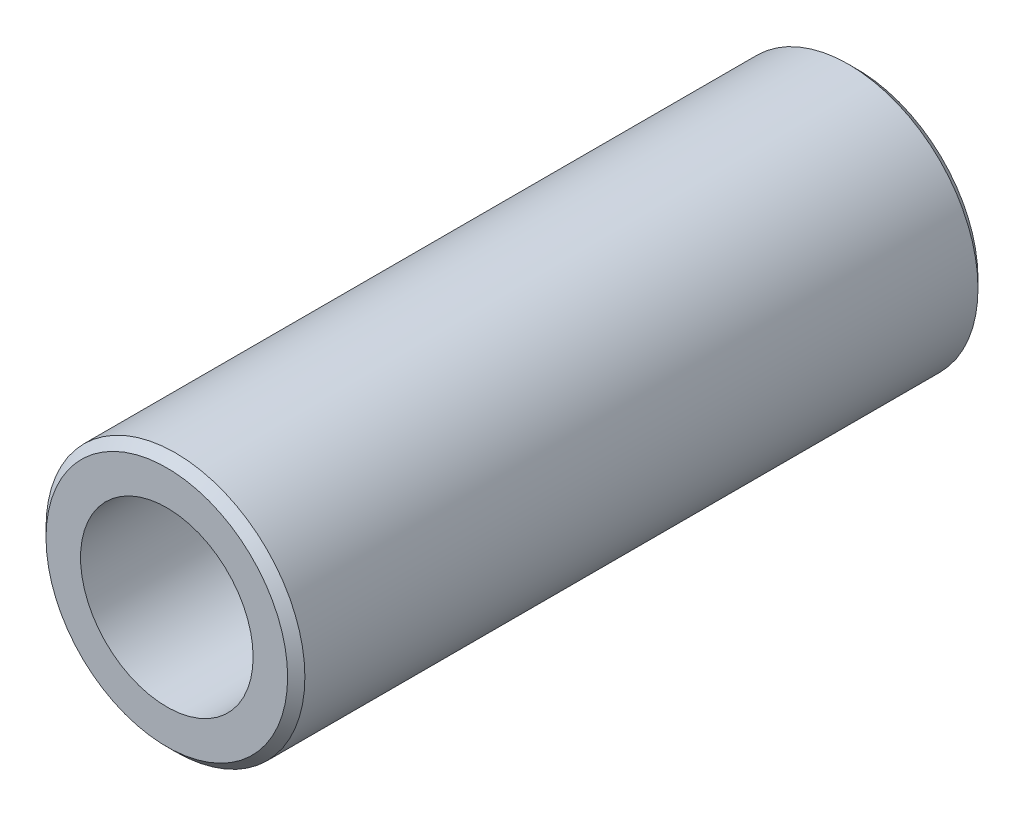
ISO-10303-21;
HEADER;
FILE_DESCRIPTION(('STEP AP214'),'2;1');
FILE_NAME('part.step','',(''),(''),'','','');
FILE_SCHEMA(('AUTOMOTIVE_DESIGN { 1 0 10303 214 1 1 1 1 }'));
ENDSEC;
DATA;
#1=APPLICATION_CONTEXT('core data for automotive mechanical design processes');
#2=APPLICATION_PROTOCOL_DEFINITION('international standard','automotive_design',2000,#1);
#3=PRODUCT_CONTEXT('',#1,'mechanical');
#4=PRODUCT('Part','Part','',(#3));
#5=PRODUCT_RELATED_PRODUCT_CATEGORY('part','',(#4));
#6=PRODUCT_DEFINITION_FORMATION('','',#4);
#7=PRODUCT_DEFINITION_CONTEXT('part definition',#1,'design');
#8=PRODUCT_DEFINITION('design','',#6,#7);
#9=PRODUCT_DEFINITION_SHAPE('','',#8);
#10=(LENGTH_UNIT() NAMED_UNIT(*) SI_UNIT(.MILLI.,.METRE.));
#11=(NAMED_UNIT(*) PLANE_ANGLE_UNIT() SI_UNIT($,.RADIAN.));
#12=(NAMED_UNIT(*) SI_UNIT($,.STERADIAN.) SOLID_ANGLE_UNIT());
#13=UNCERTAINTY_MEASURE_WITH_UNIT(LENGTH_MEASURE(1.E-05),#10,'distance_accuracy_value','');
#14=(GEOMETRIC_REPRESENTATION_CONTEXT(3) GLOBAL_UNCERTAINTY_ASSIGNED_CONTEXT((#13)) GLOBAL_UNIT_ASSIGNED_CONTEXT((#10,
#11,#12)) REPRESENTATION_CONTEXT('',''));
#15=CARTESIAN_POINT('',(0.,0.,0.));
#16=DIRECTION('',(0.,0.,1.));
#17=DIRECTION('',(1.,0.,0.));
#18=AXIS2_PLACEMENT_3D('',#15,#16,#17);
#19=CARTESIAN_POINT('',(0.,0.,0.));
#20=DIRECTION('',(0.,0.,1.));
#21=DIRECTION('',(1.,0.,0.));
#22=AXIS2_PLACEMENT_3D('',#19,#20,#21);
#23=CYLINDRICAL_SURFACE('',#22,5.);
#24=CARTESIAN_POINT('',(0.,0.,-40.));
#25=DIRECTION('',(0.,0.,1.));
#26=DIRECTION('',(1.,0.,0.));
#27=AXIS2_PLACEMENT_3D('',#24,#25,#26);
#28=CIRCLE('',#27,5.);
#29=CARTESIAN_POINT('',(5.,0.,-40.));
#30=VERTEX_POINT('',#29);
#31=EDGE_CURVE('E38',#30,#30,#28,.T.);
#32=ORIENTED_EDGE('',*,*,#31,.F.);
#33=EDGE_LOOP('',(#32));
#34=FACE_BOUND('',#33,.T.);
#35=CARTESIAN_POINT('',(0.,0.,0.));
#36=DIRECTION('',(0.,0.,1.));
#37=DIRECTION('',(1.,0.,0.));
#38=AXIS2_PLACEMENT_3D('',#35,#36,#37);
#39=CIRCLE('',#38,5.);
#40=CARTESIAN_POINT('',(5.,0.,0.));
#41=VERTEX_POINT('',#40);
#42=EDGE_CURVE('E35',#41,#41,#39,.T.);
#43=ORIENTED_EDGE('',*,*,#42,.T.);
#44=EDGE_LOOP('',(#43));
#45=FACE_BOUND('',#44,.T.);
#46=ADVANCED_FACE('F15',(#34,#45),#23,.F.);
#47=CARTESIAN_POINT('',(0.,5.,0.));
#48=DIRECTION('',(0.,0.,-1.));
#49=DIRECTION('',(-1.,0.,0.));
#50=AXIS2_PLACEMENT_3D('',#47,#48,#49);
#51=PLANE('',#50);
#52=CARTESIAN_POINT('',(0.,0.,0.));
#53=DIRECTION('',(0.,0.,-1.));
#54=DIRECTION('',(-1.,0.,0.));
#55=AXIS2_PLACEMENT_3D('',#52,#53,#54);
#56=CIRCLE('',#55,7.);
#57=CARTESIAN_POINT('',(-7.,0.,0.));
#58=VERTEX_POINT('',#57);
#59=EDGE_CURVE('E10',#58,#58,#56,.F.);
#60=ORIENTED_EDGE('',*,*,#59,.T.);
#61=EDGE_LOOP('',(#60));
#62=FACE_BOUND('',#61,.T.);
#63=ORIENTED_EDGE('',*,*,#42,.F.);
#64=EDGE_LOOP('',(#63));
#65=FACE_BOUND('',#64,.T.);
#66=ADVANCED_FACE('F46',(#62,#65),#51,.F.);
#67=CARTESIAN_POINT('',(0.,0.,0.));
#68=DIRECTION('',(0.,0.,1.));
#69=DIRECTION('',(1.,0.,0.));
#70=AXIS2_PLACEMENT_3D('',#67,#68,#69);
#71=CYLINDRICAL_SURFACE('',#70,7.5);
#72=CARTESIAN_POINT('',(0.,0.,-39.5));
#73=DIRECTION('',(0.,0.,1.));
#74=DIRECTION('',(1.,0.,0.));
#75=AXIS2_PLACEMENT_3D('',#72,#73,#74);
#76=CIRCLE('',#75,7.5);
#77=CARTESIAN_POINT('',(7.5,0.,-39.5));
#78=VERTEX_POINT('',#77);
#79=EDGE_CURVE('E26',#78,#78,#76,.T.);
#80=ORIENTED_EDGE('',*,*,#79,.T.);
#81=EDGE_LOOP('',(#80));
#82=FACE_BOUND('',#81,.T.);
#83=CARTESIAN_POINT('',(0.,0.,-0.499999999999992));
#84=DIRECTION('',(0.,0.,-1.));
#85=DIRECTION('',(-1.,0.,0.));
#86=AXIS2_PLACEMENT_3D('',#83,#84,#85);
#87=CIRCLE('',#86,7.5);
#88=CARTESIAN_POINT('',(-7.5,0.,-0.499999999999992));
#89=VERTEX_POINT('',#88);
#90=EDGE_CURVE('E30',#89,#89,#87,.T.);
#91=ORIENTED_EDGE('',*,*,#90,.T.);
#92=EDGE_LOOP('',(#91));
#93=FACE_BOUND('',#92,.T.);
#94=ADVANCED_FACE('F51',(#82,#93),#71,.T.);
#95=CARTESIAN_POINT('',(0.,7.5,-40.));
#96=DIRECTION('',(0.,0.,1.));
#97=DIRECTION('',(1.,0.,0.));
#98=AXIS2_PLACEMENT_3D('',#95,#96,#97);
#99=PLANE('',#98);
#100=CARTESIAN_POINT('',(0.,0.,-40.));
#101=DIRECTION('',(0.,0.,1.));
#102=DIRECTION('',(1.,0.,0.));
#103=AXIS2_PLACEMENT_3D('',#100,#101,#102);
#104=CIRCLE('',#103,7.);
#105=CARTESIAN_POINT('',(7.,0.,-40.));
#106=VERTEX_POINT('',#105);
#107=EDGE_CURVE('E22',#106,#106,#104,.F.);
#108=ORIENTED_EDGE('',*,*,#107,.T.);
#109=EDGE_LOOP('',(#108));
#110=FACE_BOUND('',#109,.T.);
#111=ORIENTED_EDGE('',*,*,#31,.T.);
#112=EDGE_LOOP('',(#111));
#113=FACE_BOUND('',#112,.T.);
#114=ADVANCED_FACE('F42',(#110,#113),#99,.F.);
#115=CARTESIAN_POINT('',(0.,0.,-39.5));
#116=DIRECTION('',(0.,0.,1.));
#117=DIRECTION('',(1.,0.,0.));
#118=AXIS2_PLACEMENT_3D('',#115,#116,#117);
#119=CONICAL_SURFACE('',#118,7.5,0.785398163397452);
#120=ORIENTED_EDGE('',*,*,#107,.F.);
#121=EDGE_LOOP('',(#120));
#122=FACE_BOUND('',#121,.T.);
#123=ORIENTED_EDGE('',*,*,#79,.F.);
#124=EDGE_LOOP('',(#123));
#125=FACE_BOUND('',#124,.T.);
#126=ADVANCED_FACE('F61',(#122,#125),#119,.T.);
#127=CARTESIAN_POINT('',(0.,0.,0.));
#128=DIRECTION('',(0.,0.,-1.));
#129=DIRECTION('',(-1.,0.,0.));
#130=AXIS2_PLACEMENT_3D('',#127,#128,#129);
#131=CONICAL_SURFACE('',#130,7.,0.785398163397451);
#132=ORIENTED_EDGE('',*,*,#90,.F.);
#133=EDGE_LOOP('',(#132));
#134=FACE_BOUND('',#133,.T.);
#135=ORIENTED_EDGE('',*,*,#59,.F.);
#136=EDGE_LOOP('',(#135));
#137=FACE_BOUND('',#136,.T.);
#138=ADVANCED_FACE('F17',(#134,#137),#131,.T.);
#139=CLOSED_SHELL('',(#46,#66,#94,#114,#126,#138));
#140=MANIFOLD_SOLID_BREP('B1',#139);
#141=ADVANCED_BREP_SHAPE_REPRESENTATION('',(#18,#140),#14);
#142=SHAPE_DEFINITION_REPRESENTATION(#9,#141);
ENDSEC;
END-ISO-10303-21;
